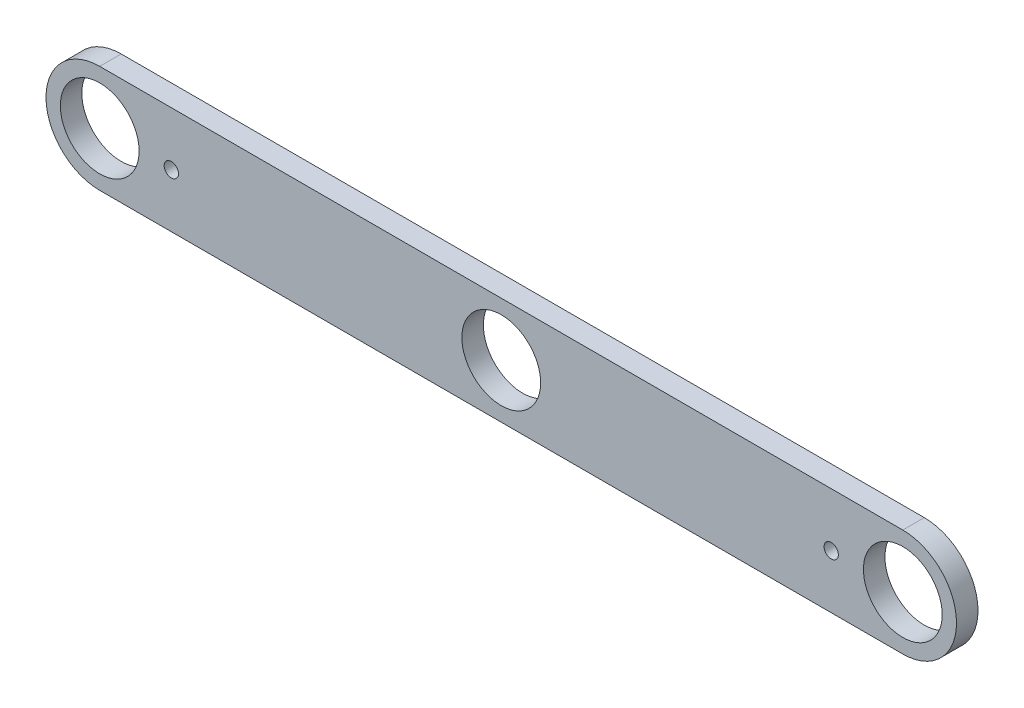
ISO-10303-21;
HEADER;
FILE_DESCRIPTION(('STEP AP214'),'2;1');
FILE_NAME('part.step','',(''),(''),'','','');
FILE_SCHEMA(('AUTOMOTIVE_DESIGN { 1 0 10303 214 1 1 1 1 }'));
ENDSEC;
DATA;
#1=APPLICATION_CONTEXT('core data for automotive mechanical design processes');
#2=APPLICATION_PROTOCOL_DEFINITION('international standard','automotive_design',2000,#1);
#3=PRODUCT_CONTEXT('',#1,'mechanical');
#4=PRODUCT('Part','Part','',(#3));
#5=PRODUCT_RELATED_PRODUCT_CATEGORY('part','',(#4));
#6=PRODUCT_DEFINITION_FORMATION('','',#4);
#7=PRODUCT_DEFINITION_CONTEXT('part definition',#1,'design');
#8=PRODUCT_DEFINITION('design','',#6,#7);
#9=PRODUCT_DEFINITION_SHAPE('','',#8);
#10=(LENGTH_UNIT() NAMED_UNIT(*) SI_UNIT(.MILLI.,.METRE.));
#11=(NAMED_UNIT(*) PLANE_ANGLE_UNIT() SI_UNIT($,.RADIAN.));
#12=(NAMED_UNIT(*) SI_UNIT($,.STERADIAN.) SOLID_ANGLE_UNIT());
#13=UNCERTAINTY_MEASURE_WITH_UNIT(LENGTH_MEASURE(1.E-05),#10,'distance_accuracy_value','');
#14=(GEOMETRIC_REPRESENTATION_CONTEXT(3) GLOBAL_UNCERTAINTY_ASSIGNED_CONTEXT((#13)) GLOBAL_UNIT_ASSIGNED_CONTEXT((#10,
#11,#12)) REPRESENTATION_CONTEXT('',''));
#15=CARTESIAN_POINT('',(0.,0.,0.));
#16=DIRECTION('',(0.,0.,1.));
#17=DIRECTION('',(1.,0.,0.));
#18=AXIS2_PLACEMENT_3D('',#15,#16,#17);
#19=CARTESIAN_POINT('',(112.155,0.,-6.));
#20=DIRECTION('',(0.,0.,-1.));
#21=DIRECTION('',(1.,0.,0.));
#22=AXIS2_PLACEMENT_3D('',#19,#20,#21);
#23=PLANE('',#22);
#24=CARTESIAN_POINT('',(-92.155,0.,-6.));
#25=DIRECTION('',(0.,0.,1.));
#26=DIRECTION('',(1.,0.,0.));
#27=AXIS2_PLACEMENT_3D('',#24,#25,#26);
#28=CIRCLE('',#27,2.);
#29=CARTESIAN_POINT('',(-90.155,0.,-6.));
#30=VERTEX_POINT('',#29);
#31=EDGE_CURVE('E155',#30,#30,#28,.T.);
#32=ORIENTED_EDGE('',*,*,#31,.T.);
#33=EDGE_LOOP('',(#32));
#34=FACE_BOUND('',#33,.T.);
#35=CARTESIAN_POINT('',(112.155,0.,-6.));
#36=DIRECTION('',(0.,0.,1.));
#37=DIRECTION('',(1.,0.,0.));
#38=AXIS2_PLACEMENT_3D('',#35,#36,#37);
#39=CIRCLE('',#38,11.);
#40=CARTESIAN_POINT('',(123.155,0.,-6.));
#41=VERTEX_POINT('',#40);
#42=EDGE_CURVE('E139',#41,#41,#39,.T.);
#43=ORIENTED_EDGE('',*,*,#42,.T.);
#44=EDGE_LOOP('',(#43));
#45=FACE_BOUND('',#44,.T.);
#46=CARTESIAN_POINT('',(112.155,0.,-6.));
#47=DIRECTION('',(0.,0.,1.));
#48=DIRECTION('',(1.,0.,0.));
#49=AXIS2_PLACEMENT_3D('',#46,#47,#48);
#50=CIRCLE('',#49,15.);
#51=CARTESIAN_POINT('',(112.155,-14.9999999999999,-6.));
#52=VERTEX_POINT('',#51);
#53=CARTESIAN_POINT('',(112.155,15.,-6.));
#54=VERTEX_POINT('',#53);
#55=EDGE_CURVE('E106',#52,#54,#50,.T.);
#56=ORIENTED_EDGE('',*,*,#55,.F.);
#57=DIRECTION('',(1.,0.,0.));
#58=VECTOR('',#57,1.);
#59=CARTESIAN_POINT('',(112.155,-14.9999999999999,-6.));
#60=LINE('',#59,#58);
#61=CARTESIAN_POINT('',(-112.155,-15.,-6.));
#62=VERTEX_POINT('',#61);
#63=EDGE_CURVE('E109',#62,#52,#60,.T.);
#64=ORIENTED_EDGE('',*,*,#63,.F.);
#65=CARTESIAN_POINT('',(-112.155,0.,-6.));
#66=DIRECTION('',(0.,0.,1.));
#67=DIRECTION('',(1.,0.,0.));
#68=AXIS2_PLACEMENT_3D('',#65,#66,#67);
#69=CIRCLE('',#68,15.);
#70=CARTESIAN_POINT('',(-112.155,15.,-6.));
#71=VERTEX_POINT('',#70);
#72=EDGE_CURVE('E95',#71,#62,#69,.T.);
#73=ORIENTED_EDGE('',*,*,#72,.F.);
#74=DIRECTION('',(-1.,0.,0.));
#75=VECTOR('',#74,1.);
#76=CARTESIAN_POINT('',(112.155,15.,-6.));
#77=LINE('',#76,#75);
#78=EDGE_CURVE('E101',#54,#71,#77,.T.);
#79=ORIENTED_EDGE('',*,*,#78,.F.);
#80=EDGE_LOOP('',(#56,#64,#73,#79));
#81=FACE_BOUND('',#80,.T.);
#82=CARTESIAN_POINT('',(0.,0.,-6.));
#83=DIRECTION('',(0.,0.,1.));
#84=DIRECTION('',(1.,0.,0.));
#85=AXIS2_PLACEMENT_3D('',#82,#83,#84);
#86=CIRCLE('',#85,11.);
#87=CARTESIAN_POINT('',(11.,0.,-6.));
#88=VERTEX_POINT('',#87);
#89=EDGE_CURVE('E121',#88,#88,#86,.T.);
#90=ORIENTED_EDGE('',*,*,#89,.T.);
#91=EDGE_LOOP('',(#90));
#92=FACE_BOUND('',#91,.T.);
#93=CARTESIAN_POINT('',(-112.155,0.,-6.));
#94=DIRECTION('',(0.,0.,1.));
#95=DIRECTION('',(1.,0.,0.));
#96=AXIS2_PLACEMENT_3D('',#93,#94,#95);
#97=CIRCLE('',#96,11.);
#98=CARTESIAN_POINT('',(-101.155,0.,-6.));
#99=VERTEX_POINT('',#98);
#100=EDGE_CURVE('E147',#99,#99,#97,.T.);
#101=ORIENTED_EDGE('',*,*,#100,.T.);
#102=EDGE_LOOP('',(#101));
#103=FACE_BOUND('',#102,.T.);
#104=CARTESIAN_POINT('',(92.155,0.,-6.));
#105=DIRECTION('',(0.,0.,1.));
#106=DIRECTION('',(1.,0.,0.));
#107=AXIS2_PLACEMENT_3D('',#104,#105,#106);
#108=CIRCLE('',#107,2.);
#109=CARTESIAN_POINT('',(94.155,0.,-6.));
#110=VERTEX_POINT('',#109);
#111=EDGE_CURVE('E163',#110,#110,#108,.T.);
#112=ORIENTED_EDGE('',*,*,#111,.T.);
#113=EDGE_LOOP('',(#112));
#114=FACE_BOUND('',#113,.T.);
#115=ADVANCED_FACE('F47',(#34,#45,#81,#92,#103,#114),#23,.T.);
#116=CARTESIAN_POINT('',(112.155,0.,0.));
#117=DIRECTION('',(0.,0.,-1.));
#118=DIRECTION('',(1.,0.,0.));
#119=AXIS2_PLACEMENT_3D('',#116,#117,#118);
#120=PLANE('',#119);
#121=CARTESIAN_POINT('',(112.155,0.,0.));
#122=DIRECTION('',(0.,0.,1.));
#123=DIRECTION('',(1.,0.,0.));
#124=AXIS2_PLACEMENT_3D('',#121,#122,#123);
#125=CIRCLE('',#124,15.);
#126=CARTESIAN_POINT('',(112.155,-14.9999999999999,0.));
#127=VERTEX_POINT('',#126);
#128=CARTESIAN_POINT('',(112.155,15.,0.));
#129=VERTEX_POINT('',#128);
#130=EDGE_CURVE('E116',#127,#129,#125,.T.);
#131=ORIENTED_EDGE('',*,*,#130,.T.);
#132=DIRECTION('',(-1.,0.,0.));
#133=VECTOR('',#132,1.);
#134=CARTESIAN_POINT('',(112.155,15.,0.));
#135=LINE('',#134,#133);
#136=CARTESIAN_POINT('',(-112.155,15.,0.));
#137=VERTEX_POINT('',#136);
#138=EDGE_CURVE('E120',#129,#137,#135,.T.);
#139=ORIENTED_EDGE('',*,*,#138,.T.);
#140=CARTESIAN_POINT('',(-112.155,0.,0.));
#141=DIRECTION('',(0.,0.,1.));
#142=DIRECTION('',(1.,0.,0.));
#143=AXIS2_PLACEMENT_3D('',#140,#141,#142);
#144=CIRCLE('',#143,15.);
#145=CARTESIAN_POINT('',(-112.155,-15.,0.));
#146=VERTEX_POINT('',#145);
#147=EDGE_CURVE('E98',#137,#146,#144,.T.);
#148=ORIENTED_EDGE('',*,*,#147,.T.);
#149=DIRECTION('',(1.,0.,0.));
#150=VECTOR('',#149,1.);
#151=CARTESIAN_POINT('',(112.155,-14.9999999999999,0.));
#152=LINE('',#151,#150);
#153=EDGE_CURVE('E126',#146,#127,#152,.T.);
#154=ORIENTED_EDGE('',*,*,#153,.T.);
#155=EDGE_LOOP('',(#131,#139,#148,#154));
#156=FACE_BOUND('',#155,.T.);
#157=CARTESIAN_POINT('',(0.,0.,0.));
#158=DIRECTION('',(0.,0.,1.));
#159=DIRECTION('',(1.,0.,0.));
#160=AXIS2_PLACEMENT_3D('',#157,#158,#159);
#161=CIRCLE('',#160,11.);
#162=CARTESIAN_POINT('',(11.,0.,0.));
#163=VERTEX_POINT('',#162);
#164=EDGE_CURVE('E135',#163,#163,#161,.T.);
#165=ORIENTED_EDGE('',*,*,#164,.F.);
#166=EDGE_LOOP('',(#165));
#167=FACE_BOUND('',#166,.T.);
#168=CARTESIAN_POINT('',(112.155,0.,0.));
#169=DIRECTION('',(0.,0.,1.));
#170=DIRECTION('',(1.,0.,0.));
#171=AXIS2_PLACEMENT_3D('',#168,#169,#170);
#172=CIRCLE('',#171,11.);
#173=CARTESIAN_POINT('',(123.155,0.,0.));
#174=VERTEX_POINT('',#173);
#175=EDGE_CURVE('E143',#174,#174,#172,.T.);
#176=ORIENTED_EDGE('',*,*,#175,.F.);
#177=EDGE_LOOP('',(#176));
#178=FACE_BOUND('',#177,.T.);
#179=CARTESIAN_POINT('',(-112.155,0.,0.));
#180=DIRECTION('',(0.,0.,1.));
#181=DIRECTION('',(1.,0.,0.));
#182=AXIS2_PLACEMENT_3D('',#179,#180,#181);
#183=CIRCLE('',#182,11.);
#184=CARTESIAN_POINT('',(-101.155,0.,0.));
#185=VERTEX_POINT('',#184);
#186=EDGE_CURVE('E151',#185,#185,#183,.T.);
#187=ORIENTED_EDGE('',*,*,#186,.F.);
#188=EDGE_LOOP('',(#187));
#189=FACE_BOUND('',#188,.T.);
#190=CARTESIAN_POINT('',(-92.155,0.,0.));
#191=DIRECTION('',(0.,0.,1.));
#192=DIRECTION('',(1.,0.,0.));
#193=AXIS2_PLACEMENT_3D('',#190,#191,#192);
#194=CIRCLE('',#193,2.);
#195=CARTESIAN_POINT('',(-90.155,0.,0.));
#196=VERTEX_POINT('',#195);
#197=EDGE_CURVE('E159',#196,#196,#194,.T.);
#198=ORIENTED_EDGE('',*,*,#197,.F.);
#199=EDGE_LOOP('',(#198));
#200=FACE_BOUND('',#199,.T.);
#201=CARTESIAN_POINT('',(92.155,0.,0.));
#202=DIRECTION('',(0.,0.,1.));
#203=DIRECTION('',(1.,0.,0.));
#204=AXIS2_PLACEMENT_3D('',#201,#202,#203);
#205=CIRCLE('',#204,2.);
#206=CARTESIAN_POINT('',(94.155,0.,0.));
#207=VERTEX_POINT('',#206);
#208=EDGE_CURVE('E167',#207,#207,#205,.T.);
#209=ORIENTED_EDGE('',*,*,#208,.F.);
#210=EDGE_LOOP('',(#209));
#211=FACE_BOUND('',#210,.T.);
#212=ADVANCED_FACE('F183',(#156,#167,#178,#189,#200,#211),#120,.F.);
#213=CARTESIAN_POINT('',(112.155,0.,-6.));
#214=DIRECTION('',(0.,0.,1.));
#215=DIRECTION('',(-1.,0.,0.));
#216=AXIS2_PLACEMENT_3D('',#213,#214,#215);
#217=CYLINDRICAL_SURFACE('',#216,15.);
#218=ORIENTED_EDGE('',*,*,#130,.F.);
#219=DIRECTION('',(0.,0.,1.));
#220=VECTOR('',#219,1.);
#221=CARTESIAN_POINT('',(112.155,-14.9999999999999,-6.));
#222=LINE('',#221,#220);
#223=EDGE_CURVE('E65',#52,#127,#222,.T.);
#224=ORIENTED_EDGE('',*,*,#223,.F.);
#225=ORIENTED_EDGE('',*,*,#55,.T.);
#226=DIRECTION('',(0.,0.,1.));
#227=VECTOR('',#226,1.);
#228=CARTESIAN_POINT('',(112.155,15.,-6.));
#229=LINE('',#228,#227);
#230=EDGE_CURVE('E11',#54,#129,#229,.T.);
#231=ORIENTED_EDGE('',*,*,#230,.T.);
#232=EDGE_LOOP('',(#218,#224,#225,#231));
#233=FACE_BOUND('',#232,.T.);
#234=ADVANCED_FACE('F49',(#233),#217,.T.);
#235=CARTESIAN_POINT('',(112.155,15.,-6.));
#236=DIRECTION('',(0.,-1.,0.));
#237=DIRECTION('',(1.,0.,0.));
#238=AXIS2_PLACEMENT_3D('',#235,#236,#237);
#239=PLANE('',#238);
#240=ORIENTED_EDGE('',*,*,#138,.F.);
#241=ORIENTED_EDGE('',*,*,#230,.F.);
#242=ORIENTED_EDGE('',*,*,#78,.T.);
#243=DIRECTION('',(0.,0.,1.));
#244=VECTOR('',#243,1.);
#245=CARTESIAN_POINT('',(-112.155,15.,-6.));
#246=LINE('',#245,#244);
#247=EDGE_CURVE('E57',#71,#137,#246,.T.);
#248=ORIENTED_EDGE('',*,*,#247,.T.);
#249=EDGE_LOOP('',(#240,#241,#242,#248));
#250=FACE_BOUND('',#249,.T.);
#251=ADVANCED_FACE('F102',(#250),#239,.F.);
#252=CARTESIAN_POINT('',(-112.155,0.,-6.));
#253=DIRECTION('',(0.,0.,1.));
#254=DIRECTION('',(-1.,0.,0.));
#255=AXIS2_PLACEMENT_3D('',#252,#253,#254);
#256=CYLINDRICAL_SURFACE('',#255,15.);
#257=ORIENTED_EDGE('',*,*,#147,.F.);
#258=ORIENTED_EDGE('',*,*,#247,.F.);
#259=ORIENTED_EDGE('',*,*,#72,.T.);
#260=DIRECTION('',(0.,0.,1.));
#261=VECTOR('',#260,1.);
#262=CARTESIAN_POINT('',(-112.155,-15.,-6.));
#263=LINE('',#262,#261);
#264=EDGE_CURVE('E81',#62,#146,#263,.T.);
#265=ORIENTED_EDGE('',*,*,#264,.T.);
#266=EDGE_LOOP('',(#257,#258,#259,#265));
#267=FACE_BOUND('',#266,.T.);
#268=ADVANCED_FACE('F93',(#267),#256,.T.);
#269=CARTESIAN_POINT('',(112.155,-14.9999999999999,-6.));
#270=DIRECTION('',(0.,1.,0.));
#271=DIRECTION('',(-1.,0.,0.));
#272=AXIS2_PLACEMENT_3D('',#269,#270,#271);
#273=PLANE('',#272);
#274=ORIENTED_EDGE('',*,*,#153,.F.);
#275=ORIENTED_EDGE('',*,*,#264,.F.);
#276=ORIENTED_EDGE('',*,*,#63,.T.);
#277=ORIENTED_EDGE('',*,*,#223,.T.);
#278=EDGE_LOOP('',(#274,#275,#276,#277));
#279=FACE_BOUND('',#278,.T.);
#280=ADVANCED_FACE('F195',(#279),#273,.F.);
#281=CARTESIAN_POINT('',(0.,0.,-6.));
#282=DIRECTION('',(0.,0.,1.));
#283=DIRECTION('',(-1.,0.,0.));
#284=AXIS2_PLACEMENT_3D('',#281,#282,#283);
#285=CYLINDRICAL_SURFACE('',#284,11.);
#286=ORIENTED_EDGE('',*,*,#89,.F.);
#287=EDGE_LOOP('',(#286));
#288=FACE_BOUND('',#287,.T.);
#289=ORIENTED_EDGE('',*,*,#164,.T.);
#290=EDGE_LOOP('',(#289));
#291=FACE_BOUND('',#290,.T.);
#292=ADVANCED_FACE('F198',(#288,#291),#285,.F.);
#293=CARTESIAN_POINT('',(112.155,0.,-6.));
#294=DIRECTION('',(0.,0.,1.));
#295=DIRECTION('',(-1.,0.,0.));
#296=AXIS2_PLACEMENT_3D('',#293,#294,#295);
#297=CYLINDRICAL_SURFACE('',#296,11.);
#298=ORIENTED_EDGE('',*,*,#42,.F.);
#299=EDGE_LOOP('',(#298));
#300=FACE_BOUND('',#299,.T.);
#301=ORIENTED_EDGE('',*,*,#175,.T.);
#302=EDGE_LOOP('',(#301));
#303=FACE_BOUND('',#302,.T.);
#304=ADVANCED_FACE('F219',(#300,#303),#297,.F.);
#305=CARTESIAN_POINT('',(-112.155,0.,-6.));
#306=DIRECTION('',(0.,0.,1.));
#307=DIRECTION('',(-1.,0.,0.));
#308=AXIS2_PLACEMENT_3D('',#305,#306,#307);
#309=CYLINDRICAL_SURFACE('',#308,11.);
#310=ORIENTED_EDGE('',*,*,#100,.F.);
#311=EDGE_LOOP('',(#310));
#312=FACE_BOUND('',#311,.T.);
#313=ORIENTED_EDGE('',*,*,#186,.T.);
#314=EDGE_LOOP('',(#313));
#315=FACE_BOUND('',#314,.T.);
#316=ADVANCED_FACE('F226',(#312,#315),#309,.F.);
#317=CARTESIAN_POINT('',(-92.155,0.,-6.));
#318=DIRECTION('',(0.,0.,1.));
#319=DIRECTION('',(-1.,0.,0.));
#320=AXIS2_PLACEMENT_3D('',#317,#318,#319);
#321=CYLINDRICAL_SURFACE('',#320,2.);
#322=ORIENTED_EDGE('',*,*,#31,.F.);
#323=EDGE_LOOP('',(#322));
#324=FACE_BOUND('',#323,.T.);
#325=ORIENTED_EDGE('',*,*,#197,.T.);
#326=EDGE_LOOP('',(#325));
#327=FACE_BOUND('',#326,.T.);
#328=ADVANCED_FACE('F179',(#324,#327),#321,.F.);
#329=CARTESIAN_POINT('',(92.155,0.,-6.));
#330=DIRECTION('',(0.,0.,1.));
#331=DIRECTION('',(-1.,0.,0.));
#332=AXIS2_PLACEMENT_3D('',#329,#330,#331);
#333=CYLINDRICAL_SURFACE('',#332,2.);
#334=ORIENTED_EDGE('',*,*,#111,.F.);
#335=EDGE_LOOP('',(#334));
#336=FACE_BOUND('',#335,.T.);
#337=ORIENTED_EDGE('',*,*,#208,.T.);
#338=EDGE_LOOP('',(#337));
#339=FACE_BOUND('',#338,.T.);
#340=ADVANCED_FACE('F176',(#336,#339),#333,.F.);
#341=CLOSED_SHELL('',(#115,#212,#234,#251,#268,#280,#292,#304,#316,#328,#340));
#342=MANIFOLD_SOLID_BREP('B2',#341);
#343=ADVANCED_BREP_SHAPE_REPRESENTATION('',(#18,#342),#14);
#344=SHAPE_DEFINITION_REPRESENTATION(#9,#343);
ENDSEC;
END-ISO-10303-21;
